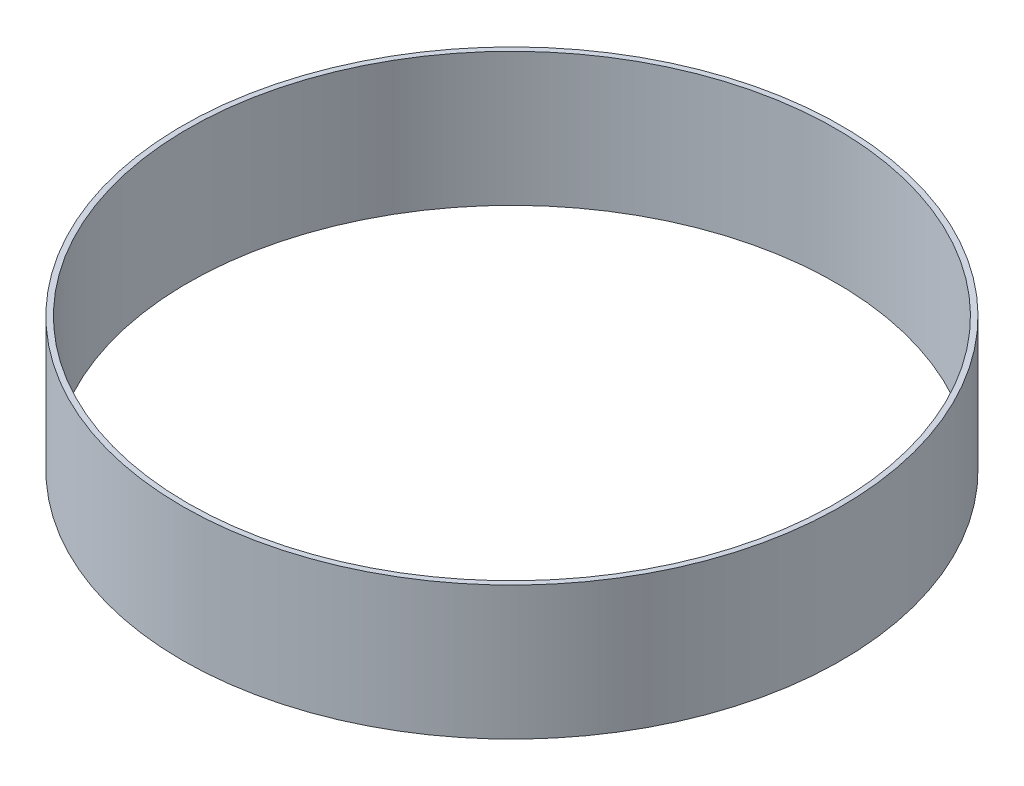
ISO-10303-21;
HEADER;
FILE_DESCRIPTION(('STEP AP214'),'2;1');
FILE_NAME('part.step','',(''),(''),'','','');
FILE_SCHEMA(('AUTOMOTIVE_DESIGN { 1 0 10303 214 1 1 1 1 }'));
ENDSEC;
DATA;
#1=APPLICATION_CONTEXT('core data for automotive mechanical design processes');
#2=APPLICATION_PROTOCOL_DEFINITION('international standard','automotive_design',2000,#1);
#3=PRODUCT_CONTEXT('',#1,'mechanical');
#4=PRODUCT('Part','Part','',(#3));
#5=PRODUCT_RELATED_PRODUCT_CATEGORY('part','',(#4));
#6=PRODUCT_DEFINITION_FORMATION('','',#4);
#7=PRODUCT_DEFINITION_CONTEXT('part definition',#1,'design');
#8=PRODUCT_DEFINITION('design','',#6,#7);
#9=PRODUCT_DEFINITION_SHAPE('','',#8);
#10=(LENGTH_UNIT() NAMED_UNIT(*) SI_UNIT(.MILLI.,.METRE.));
#11=(NAMED_UNIT(*) PLANE_ANGLE_UNIT() SI_UNIT($,.RADIAN.));
#12=(NAMED_UNIT(*) SI_UNIT($,.STERADIAN.) SOLID_ANGLE_UNIT());
#13=UNCERTAINTY_MEASURE_WITH_UNIT(LENGTH_MEASURE(1.E-05),#10,'distance_accuracy_value','');
#14=(GEOMETRIC_REPRESENTATION_CONTEXT(3) GLOBAL_UNCERTAINTY_ASSIGNED_CONTEXT((#13)) GLOBAL_UNIT_ASSIGNED_CONTEXT((#10,
#11,#12)) REPRESENTATION_CONTEXT('',''));
#15=CARTESIAN_POINT('',(0.,0.,0.));
#16=DIRECTION('',(0.,0.,1.));
#17=DIRECTION('',(1.,0.,0.));
#18=AXIS2_PLACEMENT_3D('',#15,#16,#17);
#19=CARTESIAN_POINT('',(0.,25.,0.));
#20=DIRECTION('',(0.,1.,0.));
#21=DIRECTION('',(0.,0.,1.));
#22=AXIS2_PLACEMENT_3D('',#19,#20,#21);
#23=PLANE('',#22);
#24=CARTESIAN_POINT('',(0.,25.,0.));
#25=DIRECTION('',(0.,1.,0.));
#26=DIRECTION('',(0.,0.,1.));
#27=AXIS2_PLACEMENT_3D('',#24,#25,#26);
#28=CIRCLE('',#27,123.5);
#29=CARTESIAN_POINT('',(0.,25.,123.5));
#30=VERTEX_POINT('',#29);
#31=EDGE_CURVE('E10',#30,#30,#28,.T.);
#32=ORIENTED_EDGE('',*,*,#31,.T.);
#33=EDGE_LOOP('',(#32));
#34=FACE_BOUND('',#33,.T.);
#35=CARTESIAN_POINT('',(0.,25.,0.));
#36=DIRECTION('',(0.,1.,0.));
#37=DIRECTION('',(0.,0.,1.));
#38=AXIS2_PLACEMENT_3D('',#35,#36,#37);
#39=CIRCLE('',#38,121.5);
#40=CARTESIAN_POINT('',(0.,25.,121.5));
#41=VERTEX_POINT('',#40);
#42=EDGE_CURVE('E42',#41,#41,#39,.T.);
#43=ORIENTED_EDGE('',*,*,#42,.F.);
#44=EDGE_LOOP('',(#43));
#45=FACE_BOUND('',#44,.T.);
#46=ADVANCED_FACE('F31',(#34,#45),#23,.T.);
#47=CARTESIAN_POINT('',(0.,-25.,0.));
#48=DIRECTION('',(0.,1.,0.));
#49=DIRECTION('',(0.,0.,1.));
#50=AXIS2_PLACEMENT_3D('',#47,#48,#49);
#51=PLANE('',#50);
#52=CARTESIAN_POINT('',(0.,-25.,0.));
#53=DIRECTION('',(0.,1.,0.));
#54=DIRECTION('',(0.,0.,1.));
#55=AXIS2_PLACEMENT_3D('',#52,#53,#54);
#56=CIRCLE('',#55,123.5);
#57=CARTESIAN_POINT('',(0.,-25.,123.5));
#58=VERTEX_POINT('',#57);
#59=EDGE_CURVE('E35',#58,#58,#56,.T.);
#60=ORIENTED_EDGE('',*,*,#59,.F.);
#61=EDGE_LOOP('',(#60));
#62=FACE_BOUND('',#61,.T.);
#63=CARTESIAN_POINT('',(0.,-25.,0.));
#64=DIRECTION('',(0.,1.,0.));
#65=DIRECTION('',(0.,0.,1.));
#66=AXIS2_PLACEMENT_3D('',#63,#64,#65);
#67=CIRCLE('',#66,121.5);
#68=CARTESIAN_POINT('',(0.,-25.,121.5));
#69=VERTEX_POINT('',#68);
#70=EDGE_CURVE('E44',#69,#69,#67,.T.);
#71=ORIENTED_EDGE('',*,*,#70,.T.);
#72=EDGE_LOOP('',(#71));
#73=FACE_BOUND('',#72,.T.);
#74=ADVANCED_FACE('F54',(#62,#73),#51,.F.);
#75=CARTESIAN_POINT('',(0.,25.,0.));
#76=DIRECTION('',(0.,-1.,0.));
#77=DIRECTION('',(0.,0.,-1.));
#78=AXIS2_PLACEMENT_3D('',#75,#76,#77);
#79=CYLINDRICAL_SURFACE('',#78,123.5);
#80=ORIENTED_EDGE('',*,*,#31,.F.);
#81=EDGE_LOOP('',(#80));
#82=FACE_BOUND('',#81,.T.);
#83=ORIENTED_EDGE('',*,*,#59,.T.);
#84=EDGE_LOOP('',(#83));
#85=FACE_BOUND('',#84,.T.);
#86=ADVANCED_FACE('F33',(#82,#85),#79,.T.);
#87=CARTESIAN_POINT('',(0.,25.,0.));
#88=DIRECTION('',(0.,-1.,0.));
#89=DIRECTION('',(0.,0.,-1.));
#90=AXIS2_PLACEMENT_3D('',#87,#88,#89);
#91=CYLINDRICAL_SURFACE('',#90,121.5);
#92=ORIENTED_EDGE('',*,*,#42,.T.);
#93=EDGE_LOOP('',(#92));
#94=FACE_BOUND('',#93,.T.);
#95=ORIENTED_EDGE('',*,*,#70,.F.);
#96=EDGE_LOOP('',(#95));
#97=FACE_BOUND('',#96,.T.);
#98=ADVANCED_FACE('F50',(#94,#97),#91,.F.);
#99=CLOSED_SHELL('',(#46,#74,#86,#98));
#100=MANIFOLD_SOLID_BREP('B2',#99);
#101=ADVANCED_BREP_SHAPE_REPRESENTATION('',(#18,#100),#14);
#102=SHAPE_DEFINITION_REPRESENTATION(#9,#101);
ENDSEC;
END-ISO-10303-21;
